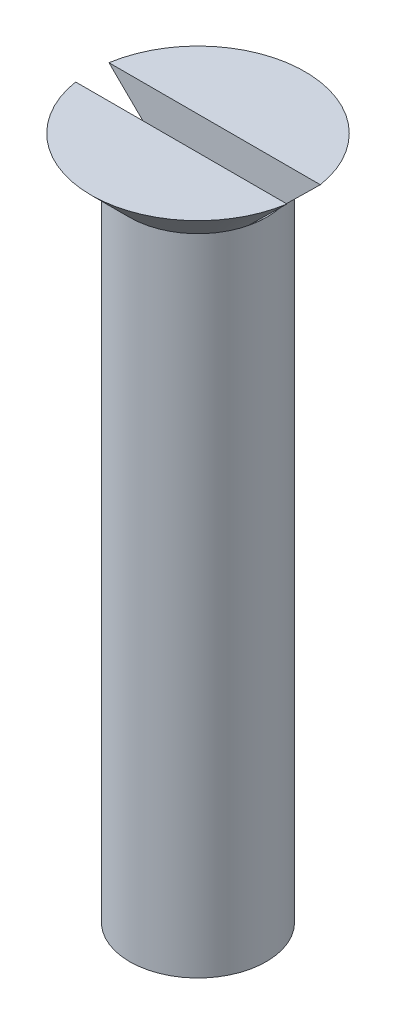
ISO-10303-21;
HEADER;
FILE_DESCRIPTION(('STEP AP214'),'2;1');
FILE_NAME('part.step','',(''),(''),'','','');
FILE_SCHEMA(('AUTOMOTIVE_DESIGN { 1 0 10303 214 1 1 1 1 }'));
ENDSEC;
DATA;
#1=APPLICATION_CONTEXT('core data for automotive mechanical design processes');
#2=APPLICATION_PROTOCOL_DEFINITION('international standard','automotive_design',2000,#1);
#3=PRODUCT_CONTEXT('',#1,'mechanical');
#4=PRODUCT('Part','Part','',(#3));
#5=PRODUCT_RELATED_PRODUCT_CATEGORY('part','',(#4));
#6=PRODUCT_DEFINITION_FORMATION('','',#4);
#7=PRODUCT_DEFINITION_CONTEXT('part definition',#1,'design');
#8=PRODUCT_DEFINITION('design','',#6,#7);
#9=PRODUCT_DEFINITION_SHAPE('','',#8);
#10=(LENGTH_UNIT() NAMED_UNIT(*) SI_UNIT(.MILLI.,.METRE.));
#11=(NAMED_UNIT(*) PLANE_ANGLE_UNIT() SI_UNIT($,.RADIAN.));
#12=(NAMED_UNIT(*) SI_UNIT($,.STERADIAN.) SOLID_ANGLE_UNIT());
#13=UNCERTAINTY_MEASURE_WITH_UNIT(LENGTH_MEASURE(1.E-05),#10,'distance_accuracy_value','');
#14=(GEOMETRIC_REPRESENTATION_CONTEXT(3) GLOBAL_UNCERTAINTY_ASSIGNED_CONTEXT((#13)) GLOBAL_UNIT_ASSIGNED_CONTEXT((#10,
#11,#12)) REPRESENTATION_CONTEXT('',''));
#15=CARTESIAN_POINT('',(0.,0.,0.));
#16=DIRECTION('',(0.,0.,1.));
#17=DIRECTION('',(1.,0.,0.));
#18=AXIS2_PLACEMENT_3D('',#15,#16,#17);
#19=CARTESIAN_POINT('',(0.,13.2071067811865,0.));
#20=DIRECTION('',(0.,1.,0.));
#21=DIRECTION('',(0.,0.,1.));
#22=AXIS2_PLACEMENT_3D('',#19,#20,#21);
#23=PLANE('',#22);
#24=DIRECTION('',(1.,0.,0.));
#25=VECTOR('',#24,1.);
#26=CARTESIAN_POINT('',(0.,13.2071067811865,0.609940202224758));
#27=LINE('',#26,#25);
#28=CARTESIAN_POINT('',(-3.86639893978564,13.2071067811865,0.609940202224758));
#29=VERTEX_POINT('',#28);
#30=CARTESIAN_POINT('',(3.86639893978564,13.2071067811865,0.609940202224758));
#31=VERTEX_POINT('',#30);
#32=EDGE_CURVE('E62',#29,#31,#27,.T.);
#33=ORIENTED_EDGE('',*,*,#32,.F.);
#34=CARTESIAN_POINT('',(0.,13.2071067811865,0.));
#35=DIRECTION('',(0.,1.,0.));
#36=DIRECTION('',(0.,0.,1.));
#37=AXIS2_PLACEMENT_3D('',#34,#35,#36);
#38=CIRCLE('',#37,3.9142135623731);
#39=EDGE_CURVE('E104',#29,#31,#38,.T.);
#40=ORIENTED_EDGE('',*,*,#39,.T.);
#41=EDGE_LOOP('',(#33,#40));
#42=FACE_BOUND('',#41,.T.);
#43=ADVANCED_FACE('F35',(#42),#23,.T.);
#44=DIRECTION('',(-1.,0.,0.));
#45=VECTOR('',#44,1.);
#46=CARTESIAN_POINT('',(0.,13.2071067811865,-0.609940202224758));
#47=LINE('',#46,#45);
#48=CARTESIAN_POINT('',(3.86639893978564,13.2071067811865,-0.609940202224758));
#49=VERTEX_POINT('',#48);
#50=CARTESIAN_POINT('',(-3.86639893978564,13.2071067811865,-0.609940202224758));
#51=VERTEX_POINT('',#50);
#52=EDGE_CURVE('E86',#49,#51,#47,.T.);
#53=ORIENTED_EDGE('',*,*,#52,.F.);
#54=EDGE_CURVE('E103',#49,#51,#38,.T.);
#55=ORIENTED_EDGE('',*,*,#54,.T.);
#56=EDGE_LOOP('',(#53,#55));
#57=FACE_BOUND('',#56,.T.);
#58=ADVANCED_FACE('F37',(#57),#23,.T.);
#59=CARTESIAN_POINT('',(0.,13.2071067811865,0.));
#60=DIRECTION('',(0.,1.,0.));
#61=DIRECTION('',(0.,0.,1.));
#62=AXIS2_PLACEMENT_3D('',#59,#60,#61);
#63=CONICAL_SURFACE('',#62,3.9142135623731,0.785398163397453);
#64=CARTESIAN_POINT('',(3.86710759490383,13.2078067811865,0.609940202224757));
#65=CARTESIAN_POINT('',(3.7552643602359,13.0973345493279,0.609940202224758));
#66=CARTESIAN_POINT('',(3.64336799311334,12.9869160237266,0.609940202224758));
#67=CARTESIAN_POINT('',(3.41934821074444,12.7661619771019,0.609940202224758));
#68=CARTESIAN_POINT('',(3.30722469452893,12.655826558556,0.609940202224758));
#69=CARTESIAN_POINT('',(3.08140597645209,12.4340132272008,0.609940202224758));
#70=CARTESIAN_POINT('',(2.96770830757362,12.3225378236791,0.609940202224758));
#71=CARTESIAN_POINT('',(2.74009758692697,12.0999562736426,0.609940202224758));
#72=CARTESIAN_POINT('',(2.62618472444161,11.9888499334413,0.609940202224758));
#73=CARTESIAN_POINT('',(2.35036676011451,11.720804145336,0.609940202224758));
#74=CARTESIAN_POINT('',(2.18825801636992,11.5640733864907,0.609940202224758));
#75=CARTESIAN_POINT('',(1.94376832881686,11.3299804189065,0.609940202224758));
#76=CARTESIAN_POINT('',(1.8619545147921,11.252026332735,0.609940202224758));
#77=CARTESIAN_POINT('',(1.69779170072792,11.0967245377863,0.609940202224758));
#78=CARTESIAN_POINT('',(1.61544284369653,11.0193766782587,0.609940202224758));
#79=CARTESIAN_POINT('',(1.45071485985467,10.8663235700745,0.609940202224758));
#80=CARTESIAN_POINT('',(1.3683437832088,10.7906096650266,0.609940202224758));
#81=CARTESIAN_POINT('',(1.20223254128805,10.6405187151366,0.609940202224758));
#82=CARTESIAN_POINT('',(1.11849111386217,10.5661430525838,0.609940202224757));
#83=CARTESIAN_POINT('',(0.99137709560245,10.4566825300014,0.609940202224758));
#84=CARTESIAN_POINT('',(0.948847753851313,10.420620885785,0.609940202224758));
#85=CARTESIAN_POINT('',(0.863022985932833,10.3494237277477,0.609940202224758));
#86=CARTESIAN_POINT('',(0.819727638175051,10.3142881200425,0.609940202224758));
#87=CARTESIAN_POINT('',(0.73213652075181,10.2454260187978,0.609940202224758));
#88=CARTESIAN_POINT('',(0.687842426712924,10.2116974015604,0.609940202224758));
#89=CARTESIAN_POINT('',(0.597744495539512,10.1463311013672,0.609940202224758));
#90=CARTESIAN_POINT('',(0.551941652739756,10.1146920810168,0.609940202224758));
#91=CARTESIAN_POINT('',(0.493649023818126,10.0775213739555,0.609940202224758));
#92=CARTESIAN_POINT('',(0.482196501032408,10.0703619678871,0.609940202224758));
#93=CARTESIAN_POINT('',(0.459145326801649,10.0562789847748,0.609940202224758));
#94=CARTESIAN_POINT('',(0.447546655748228,10.0493554398475,0.609940202224758));
#95=CARTESIAN_POINT('',(0.412513152985695,10.0289859217446,0.609940202224758));
#96=CARTESIAN_POINT('',(0.388841652401696,10.0159415943758,0.609940202224758));
#97=CARTESIAN_POINT('',(0.340959415048638,9.99136437041313,0.609940202224758));
#98=CARTESIAN_POINT('',(0.316754601763423,9.97982008342829,0.609940202224758));
#99=CARTESIAN_POINT('',(0.267554521681347,9.95856583269387,0.609940202224758));
#100=CARTESIAN_POINT('',(0.24255947185448,9.9488553704624,0.609940202224758));
#101=CARTESIAN_POINT('',(0.181666778841152,9.92843725124724,0.609940202224758));
#102=CARTESIAN_POINT('',(0.145370099397974,9.91885653280587,0.609940202224758));
#103=CARTESIAN_POINT('',(0.0717472854981599,9.90598118070593,0.609940202224758));
#104=CARTESIAN_POINT('',(0.0344252658352465,9.90266433866424,0.609940202224758));
#105=CARTESIAN_POINT('',(-0.0402981503893772,9.90301663425948,0.609940202224758));
#106=CARTESIAN_POINT('',(-0.0776994456806194,9.90670692841244,0.609940202224758));
#107=CARTESIAN_POINT('',(-0.151416073038481,9.92028941567601,0.609940202224758));
#108=CARTESIAN_POINT('',(-0.187727256030332,9.93020276516164,0.609940202224758));
#109=CARTESIAN_POINT('',(-0.262399597053143,9.95585639921922,0.609940202224758));
#110=CARTESIAN_POINT('',(-0.300582415833423,9.97209463605576,0.609940202224758));
#111=CARTESIAN_POINT('',(-0.375195961834449,10.0082471465006,0.609940202224758));
#112=CARTESIAN_POINT('',(-0.411623052693162,10.028168668257,0.609940202224758));
#113=CARTESIAN_POINT('',(-0.483320269388941,10.0705724031645,0.609940202224758));
#114=CARTESIAN_POINT('',(-0.51857891997791,10.0930736825167,0.609940202224758));
#115=CARTESIAN_POINT('',(-0.587953479730971,10.1396863862764,0.609940202224758));
#116=CARTESIAN_POINT('',(-0.622070429678477,10.163796280702,0.609940202224758));
#117=CARTESIAN_POINT('',(-0.692708269646539,10.2155191690095,0.609940202224758));
#118=CARTESIAN_POINT('',(-0.729145121389267,10.2432461563321,0.609940202224758));
#119=CARTESIAN_POINT('',(-0.801275259894069,10.299654162734,0.609940202224758));
#120=CARTESIAN_POINT('',(-0.836968449913129,10.3283353046948,0.609940202224758));
#121=CARTESIAN_POINT('',(-0.943244776854576,10.4154215409406,0.609940202224758));
#122=CARTESIAN_POINT('',(-1.012991440328,10.4748442792715,0.609940202224758));
#123=CARTESIAN_POINT('',(-1.15126180745171,10.5953133846318,0.609940202224758));
#124=CARTESIAN_POINT('',(-1.21978320991011,10.6563623601222,0.609940202224758));
#125=CARTESIAN_POINT('',(-1.3559325528457,10.7794100231412,0.609940202224758));
#126=CARTESIAN_POINT('',(-1.42356073216691,10.8414084468076,0.609940202224758));
#127=CARTESIAN_POINT('',(-1.55798523796875,10.9658255760617,0.609940202224758));
#128=CARTESIAN_POINT('',(-1.62478365713613,11.028242028028,0.609940202224758));
#129=CARTESIAN_POINT('',(-1.75796370878705,11.1535266040926,0.609940202224758));
#130=CARTESIAN_POINT('',(-1.82434531244259,11.2163947588008,0.609940202224758));
#131=CARTESIAN_POINT('',(-2.02291125039669,11.405362542773,0.609940202224758));
#132=CARTESIAN_POINT('',(-2.15463993677775,11.5319405143416,0.609940202224758));
#133=CARTESIAN_POINT('',(-2.41860972864389,11.7869971996889,0.609940202224758));
#134=CARTESIAN_POINT('',(-2.55084429282255,11.9154826626778,0.609940202224758));
#135=CARTESIAN_POINT('',(-2.81489418625821,12.1729629156855,0.609940202224758));
#136=CARTESIAN_POINT('',(-2.94670937715891,12.3019578475319,0.609940202224758));
#137=CARTESIAN_POINT('',(-3.21009862453955,12.5603238676488,0.609940202224758));
#138=CARTESIAN_POINT('',(-3.34167252901597,12.6896951107394,0.609940202224758));
#139=CARTESIAN_POINT('',(-3.60455653801387,12.9486232431595,0.609940202224758));
#140=CARTESIAN_POINT('',(-3.73586671216498,13.0781800617802,0.609940202224758));
#141=CARTESIAN_POINT('',(-3.86710759490383,13.2078067811865,0.609940202224757));
#142=B_SPLINE_CURVE_WITH_KNOTS('',3,(#64,#65,#66,#67,#68,#69,#70,#71,#72,#73,#74,#75,#76,#77,
#78,#79,#80,#81,#82,#83,#84,#85,#86,#87,#88,#89,#90,#91,#92,#93,#94,#95,#96,#97,#98,#99,#100,
#101,#102,#103,#104,#105,#106,#107,#108,#109,#110,#111,#112,#113,#114,#115,#116,#117,#118,#119,
#120,#121,#122,#123,#124,#125,#126,#127,#128,#129,#130,#131,#132,#133,#134,#135,#136,#137,#138,
#139,#140,#141),.UNSPECIFIED.,.F.,.F.,(4,2,2,2,2,2,2,2,2,2,2,2,2,2,2,2,2,2,2,2,2,2,2,2,2,2,2,2,
2,2,2,2,2,2,2,2,2,2,4),(0.,0.471611345427063,0.943533121067308,1.42122006642613,
1.89859487733574,2.57504440899967,2.91406055801355,3.25298954375797,3.58862918154931,
3.92459762204531,4.09186971011616,4.2591247738989,4.42611750548436,4.59300230050243,
4.63351838448308,4.6740399635539,4.75508604874296,4.83547543373014,4.91584293521181,
5.02802482054023,5.13980821619976,5.25192965413937,5.36443434851376,5.48861485690668,
5.61304238616293,5.73845732869154,5.86375464201412,6.00109241536421,6.13844794482732,
6.41328395604097,6.68859106198174,6.96382299759051,7.23808417618298,7.51236411891247,
8.06041833207578,8.61354493532474,9.16683823591725,9.72040592862867,10.2738005059029),.UNSPECIFIED.);
#143=CARTESIAN_POINT('',(-2.4725948979588,11.8396072937936,0.609940202224758));
#144=VERTEX_POINT('',#143);
#145=EDGE_CURVE('E11',#144,#29,#142,.T.);
#146=ORIENTED_EDGE('',*,*,#145,.F.);
#147=CARTESIAN_POINT('',(0.,11.8396072937936,0.));
#148=DIRECTION('',(0.,-1.,0.));
#149=DIRECTION('',(0.,0.,-1.));
#150=AXIS2_PLACEMENT_3D('',#147,#148,#149);
#151=CIRCLE('',#150,2.54671407498012);
#152=CARTESIAN_POINT('',(-2.4725948979588,11.8396072937936,-0.609940202224758));
#153=VERTEX_POINT('',#152);
#154=EDGE_CURVE('E91',#153,#144,#151,.F.);
#155=ORIENTED_EDGE('',*,*,#154,.F.);
#156=CARTESIAN_POINT('',(-3.86710759490383,13.2078067811865,-0.609940202224758));
#157=CARTESIAN_POINT('',(-3.7552643602359,13.0973345493279,-0.609940202224758));
#158=CARTESIAN_POINT('',(-3.64336799311334,12.9869160237266,-0.609940202224758));
#159=CARTESIAN_POINT('',(-3.41934821074444,12.7661619771019,-0.609940202224758));
#160=CARTESIAN_POINT('',(-3.30722469452893,12.655826558556,-0.609940202224758));
#161=CARTESIAN_POINT('',(-3.08140597645209,12.4340132272008,-0.609940202224758));
#162=CARTESIAN_POINT('',(-2.96770830757362,12.3225378236791,-0.609940202224758));
#163=CARTESIAN_POINT('',(-2.74009758692697,12.0999562736426,-0.609940202224758));
#164=CARTESIAN_POINT('',(-2.62618472444161,11.9888499334413,-0.609940202224758));
#165=CARTESIAN_POINT('',(-2.35036676011451,11.720804145336,-0.609940202224758));
#166=CARTESIAN_POINT('',(-2.18825801636992,11.5640733864907,-0.609940202224758));
#167=CARTESIAN_POINT('',(-1.94376832881686,11.3299804189065,-0.609940202224758));
#168=CARTESIAN_POINT('',(-1.8619545147921,11.252026332735,-0.609940202224758));
#169=CARTESIAN_POINT('',(-1.69779170072792,11.0967245377863,-0.609940202224758));
#170=CARTESIAN_POINT('',(-1.61544284369653,11.0193766782587,-0.609940202224758));
#171=CARTESIAN_POINT('',(-1.45071485985467,10.8663235700745,-0.609940202224758));
#172=CARTESIAN_POINT('',(-1.3683437832088,10.7906096650266,-0.609940202224758));
#173=CARTESIAN_POINT('',(-1.20223254128805,10.6405187151366,-0.609940202224758));
#174=CARTESIAN_POINT('',(-1.11849111386217,10.5661430525838,-0.609940202224758));
#175=CARTESIAN_POINT('',(-0.991377095602449,10.4566825300014,-0.609940202224758));
#176=CARTESIAN_POINT('',(-0.948847753851312,10.420620885785,-0.609940202224758));
#177=CARTESIAN_POINT('',(-0.863022985932833,10.3494237277477,-0.609940202224758));
#178=CARTESIAN_POINT('',(-0.81972763817505,10.3142881200425,-0.609940202224758));
#179=CARTESIAN_POINT('',(-0.732136520751808,10.2454260187978,-0.609940202224758));
#180=CARTESIAN_POINT('',(-0.687842426712921,10.2116974015604,-0.609940202224758));
#181=CARTESIAN_POINT('',(-0.59774449553951,10.1463311013672,-0.609940202224758));
#182=CARTESIAN_POINT('',(-0.551941652739757,10.1146920810167,-0.609940202224758));
#183=CARTESIAN_POINT('',(-0.493649023818126,10.0775213739555,-0.609940202224758));
#184=CARTESIAN_POINT('',(-0.482196501032408,10.0703619678871,-0.609940202224758));
#185=CARTESIAN_POINT('',(-0.459145326801649,10.0562789847748,-0.609940202224758));
#186=CARTESIAN_POINT('',(-0.447546655748228,10.0493554398475,-0.609940202224758));
#187=CARTESIAN_POINT('',(-0.412513152985696,10.0289859217446,-0.609940202224758));
#188=CARTESIAN_POINT('',(-0.388841652401696,10.0159415943758,-0.609940202224758));
#189=CARTESIAN_POINT('',(-0.340959415048639,9.99136437041313,-0.609940202224758));
#190=CARTESIAN_POINT('',(-0.316754601763424,9.97982008342829,-0.609940202224758));
#191=CARTESIAN_POINT('',(-0.267554521681348,9.95856583269387,-0.609940202224758));
#192=CARTESIAN_POINT('',(-0.24255947185448,9.9488553704624,-0.609940202224758));
#193=CARTESIAN_POINT('',(-0.181666778841152,9.92843725124724,-0.609940202224758));
#194=CARTESIAN_POINT('',(-0.145370099397974,9.91885653280587,-0.609940202224758));
#195=CARTESIAN_POINT('',(-0.0717472854981601,9.90598118070593,-0.609940202224758));
#196=CARTESIAN_POINT('',(-0.0344252658352467,9.90266433866424,-0.609940202224758));
#197=CARTESIAN_POINT('',(0.0402981503893771,9.90301663425948,-0.609940202224758));
#198=CARTESIAN_POINT('',(0.0776994456806193,9.90670692841244,-0.609940202224758));
#199=CARTESIAN_POINT('',(0.151416073038481,9.92028941567601,-0.609940202224758));
#200=CARTESIAN_POINT('',(0.187727256030332,9.93020276516164,-0.609940202224758));
#201=CARTESIAN_POINT('',(0.262399597053143,9.95585639921922,-0.609940202224758));
#202=CARTESIAN_POINT('',(0.300582415833424,9.97209463605576,-0.609940202224758));
#203=CARTESIAN_POINT('',(0.375195961834449,10.0082471465006,-0.609940202224758));
#204=CARTESIAN_POINT('',(0.411623052693162,10.028168668257,-0.609940202224758));
#205=CARTESIAN_POINT('',(0.483320269388941,10.0705724031645,-0.609940202224758));
#206=CARTESIAN_POINT('',(0.51857891997791,10.0930736825167,-0.609940202224758));
#207=CARTESIAN_POINT('',(0.58795347973097,10.1396863862764,-0.609940202224758));
#208=CARTESIAN_POINT('',(0.622070429678476,10.163796280702,-0.609940202224758));
#209=CARTESIAN_POINT('',(0.692708269646538,10.2155191690095,-0.609940202224758));
#210=CARTESIAN_POINT('',(0.729145121389265,10.2432461563321,-0.609940202224758));
#211=CARTESIAN_POINT('',(0.801275259894066,10.299654162734,-0.609940202224758));
#212=CARTESIAN_POINT('',(0.836968449913127,10.3283353046948,-0.609940202224758));
#213=CARTESIAN_POINT('',(0.943244776854574,10.4154215409406,-0.609940202224758));
#214=CARTESIAN_POINT('',(1.012991440328,10.4748442792715,-0.609940202224758));
#215=CARTESIAN_POINT('',(1.1512618074517,10.5953133846318,-0.609940202224758));
#216=CARTESIAN_POINT('',(1.2197832099101,10.6563623601222,-0.609940202224758));
#217=CARTESIAN_POINT('',(1.3559325528457,10.7794100231412,-0.609940202224758));
#218=CARTESIAN_POINT('',(1.42356073216691,10.8414084468076,-0.609940202224758));
#219=CARTESIAN_POINT('',(1.55798523796875,10.9658255760617,-0.609940202224758));
#220=CARTESIAN_POINT('',(1.62478365713613,11.028242028028,-0.609940202224758));
#221=CARTESIAN_POINT('',(1.75796370878705,11.1535266040926,-0.609940202224758));
#222=CARTESIAN_POINT('',(1.82434531244259,11.2163947588008,-0.609940202224758));
#223=CARTESIAN_POINT('',(2.02291125039669,11.405362542773,-0.609940202224758));
#224=CARTESIAN_POINT('',(2.15463993677775,11.5319405143416,-0.609940202224758));
#225=CARTESIAN_POINT('',(2.41860972864388,11.7869971996889,-0.609940202224758));
#226=CARTESIAN_POINT('',(2.55084429282254,11.9154826626777,-0.609940202224758));
#227=CARTESIAN_POINT('',(2.81489418625821,12.1729629156855,-0.609940202224758));
#228=CARTESIAN_POINT('',(2.9467093771589,12.3019578475319,-0.609940202224758));
#229=CARTESIAN_POINT('',(3.21009862453954,12.5603238676488,-0.609940202224758));
#230=CARTESIAN_POINT('',(3.34167252901597,12.6896951107394,-0.609940202224758));
#231=CARTESIAN_POINT('',(3.60455653801387,12.9486232431595,-0.609940202224758));
#232=CARTESIAN_POINT('',(3.73586671216498,13.0781800617802,-0.609940202224758));
#233=CARTESIAN_POINT('',(3.86710759490383,13.2078067811865,-0.609940202224758));
#234=B_SPLINE_CURVE_WITH_KNOTS('',3,(#156,#157,#158,#159,#160,#161,#162,#163,#164,#165,#166,
#167,#168,#169,#170,#171,#172,#173,#174,#175,#176,#177,#178,#179,#180,#181,#182,#183,#184,#185,
#186,#187,#188,#189,#190,#191,#192,#193,#194,#195,#196,#197,#198,#199,#200,#201,#202,#203,#204,
#205,#206,#207,#208,#209,#210,#211,#212,#213,#214,#215,#216,#217,#218,#219,#220,#221,#222,#223,
#224,#225,#226,#227,#228,#229,#230,#231,#232,#233),.UNSPECIFIED.,.F.,.F.,(4,2,2,2,2,2,2,2,2,2,2,
2,2,2,2,2,2,2,2,2,2,2,2,2,2,2,2,2,2,2,2,2,2,2,2,2,2,2,4),(0.,0.471611345427063,
0.943533121067308,1.42122006642613,1.89859487733574,2.57504440899967,2.91406055801355,
3.25298954375797,3.58862918154931,3.92459762204531,4.09186971011616,4.25912477389891,
4.42611750548436,4.59300230050243,4.63351838448308,4.67403996355389,4.75508604874296,
4.83547543373014,4.9158429352118,5.02802482054022,5.13980821619976,5.25192965413937,
5.36443434851376,5.48861485690668,5.61304238616293,5.73845732869153,5.86375464201412,
6.0010924153642,6.13844794482731,6.41328395604097,6.68859106198174,6.9638229975905,
7.23808417618297,7.51236411891246,8.06041833207578,8.61354493532474,9.16683823591725,
9.72040592862867,10.2738005059029),.UNSPECIFIED.);
#235=EDGE_CURVE('E49',#51,#153,#234,.T.);
#236=ORIENTED_EDGE('',*,*,#235,.F.);
#237=ORIENTED_EDGE('',*,*,#54,.F.);
#238=CARTESIAN_POINT('',(2.4725948979588,11.8396072937936,-0.609940202224758));
#239=VERTEX_POINT('',#238);
#240=EDGE_CURVE('E92',#239,#49,#234,.T.);
#241=ORIENTED_EDGE('',*,*,#240,.F.);
#242=CARTESIAN_POINT('',(2.4725948979588,11.8396072937936,0.609940202224758));
#243=VERTEX_POINT('',#242);
#244=EDGE_CURVE('E95',#243,#239,#151,.F.);
#245=ORIENTED_EDGE('',*,*,#244,.F.);
#246=EDGE_CURVE('E39',#31,#243,#142,.T.);
#247=ORIENTED_EDGE('',*,*,#246,.F.);
#248=ORIENTED_EDGE('',*,*,#39,.F.);
#249=EDGE_LOOP('',(#146,#155,#236,#237,#241,#245,#247,#248));
#250=FACE_BOUND('',#249,.T.);
#251=CARTESIAN_POINT('',(0.,11.7928932188135,0.));
#252=DIRECTION('',(0.,1.,0.));
#253=DIRECTION('',(0.,0.,1.));
#254=AXIS2_PLACEMENT_3D('',#251,#252,#253);
#255=CIRCLE('',#254,2.5);
#256=CARTESIAN_POINT('',(0.,11.7928932188135,2.5));
#257=VERTEX_POINT('',#256);
#258=EDGE_CURVE('E107',#257,#257,#255,.T.);
#259=ORIENTED_EDGE('',*,*,#258,.T.);
#260=EDGE_LOOP('',(#259));
#261=FACE_BOUND('',#260,.T.);
#262=ADVANCED_FACE('F98',(#250,#261),#63,.T.);
#263=CARTESIAN_POINT('',(0.,14.9922118380062,0.));
#264=DIRECTION('',(0.,1.,0.));
#265=DIRECTION('',(0.,0.,1.));
#266=AXIS2_PLACEMENT_3D('',#263,#264,#265);
#267=CYLINDRICAL_SURFACE('',#266,2.5);
#268=CARTESIAN_POINT('',(0.,-11.7928932188135,0.));
#269=DIRECTION('',(0.,1.,0.));
#270=DIRECTION('',(0.,0.,1.));
#271=AXIS2_PLACEMENT_3D('',#268,#269,#270);
#272=CIRCLE('',#271,2.5);
#273=CARTESIAN_POINT('',(0.,-11.7928932188135,2.5));
#274=VERTEX_POINT('',#273);
#275=EDGE_CURVE('E111',#274,#274,#272,.T.);
#276=ORIENTED_EDGE('',*,*,#275,.T.);
#277=EDGE_LOOP('',(#276));
#278=FACE_BOUND('',#277,.T.);
#279=ORIENTED_EDGE('',*,*,#258,.F.);
#280=EDGE_LOOP('',(#279));
#281=FACE_BOUND('',#280,.T.);
#282=ADVANCED_FACE('F118',(#278,#281),#267,.T.);
#283=CARTESIAN_POINT('',(-2.5,-11.7928932188135,0.));
#284=DIRECTION('',(0.,-1.,0.));
#285=DIRECTION('',(0.,0.,-1.));
#286=AXIS2_PLACEMENT_3D('',#283,#284,#285);
#287=PLANE('',#286);
#288=ORIENTED_EDGE('',*,*,#275,.F.);
#289=EDGE_LOOP('',(#288));
#290=FACE_BOUND('',#289,.T.);
#291=ADVANCED_FACE('F121',(#290),#287,.T.);
#292=CARTESIAN_POINT('',(-3.9142135623731,11.8396072937936,0.609940202224758));
#293=DIRECTION('',(0.,0.,1.));
#294=DIRECTION('',(0.,-1.,0.));
#295=AXIS2_PLACEMENT_3D('',#292,#293,#294);
#296=PLANE('',#295);
#297=ORIENTED_EDGE('',*,*,#246,.T.);
#298=DIRECTION('',(1.,0.,0.));
#299=VECTOR('',#298,1.);
#300=CARTESIAN_POINT('',(-3.9142135623731,11.8396072937936,0.609940202224758));
#301=LINE('',#300,#299);
#302=EDGE_CURVE('E56',#144,#243,#301,.T.);
#303=ORIENTED_EDGE('',*,*,#302,.F.);
#304=ORIENTED_EDGE('',*,*,#145,.T.);
#305=ORIENTED_EDGE('',*,*,#32,.T.);
#306=EDGE_LOOP('',(#297,#303,#304,#305));
#307=FACE_BOUND('',#306,.T.);
#308=ADVANCED_FACE('F123',(#307),#296,.F.);
#309=CARTESIAN_POINT('',(-3.9142135623731,11.8396072937936,-0.609940202224758));
#310=DIRECTION('',(0.,0.,-1.));
#311=DIRECTION('',(-1.,0.,0.));
#312=AXIS2_PLACEMENT_3D('',#309,#310,#311);
#313=PLANE('',#312);
#314=ORIENTED_EDGE('',*,*,#235,.T.);
#315=DIRECTION('',(1.,0.,0.));
#316=VECTOR('',#315,1.);
#317=CARTESIAN_POINT('',(-3.9142135623731,11.8396072937936,-0.609940202224758));
#318=LINE('',#317,#316);
#319=EDGE_CURVE('E83',#153,#239,#318,.T.);
#320=ORIENTED_EDGE('',*,*,#319,.T.);
#321=ORIENTED_EDGE('',*,*,#240,.T.);
#322=ORIENTED_EDGE('',*,*,#52,.T.);
#323=EDGE_LOOP('',(#314,#320,#321,#322));
#324=FACE_BOUND('',#323,.T.);
#325=ADVANCED_FACE('F82',(#324),#313,.F.);
#326=CARTESIAN_POINT('',(-3.9142135623731,11.8396072937936,-0.609940202224758));
#327=DIRECTION('',(0.,-1.,0.));
#328=DIRECTION('',(0.,0.,-1.));
#329=AXIS2_PLACEMENT_3D('',#326,#327,#328);
#330=PLANE('',#329);
#331=ORIENTED_EDGE('',*,*,#154,.T.);
#332=ORIENTED_EDGE('',*,*,#302,.T.);
#333=ORIENTED_EDGE('',*,*,#244,.T.);
#334=ORIENTED_EDGE('',*,*,#319,.F.);
#335=EDGE_LOOP('',(#331,#332,#333,#334));
#336=FACE_BOUND('',#335,.T.);
#337=ADVANCED_FACE('F93',(#336),#330,.F.);
#338=CLOSED_SHELL('',(#43,#58,#262,#282,#291,#308,#325,#337));
#339=MANIFOLD_SOLID_BREP('B2',#338);
#340=ADVANCED_BREP_SHAPE_REPRESENTATION('',(#18,#339),#14);
#341=SHAPE_DEFINITION_REPRESENTATION(#9,#340);
ENDSEC;
END-ISO-10303-21;
